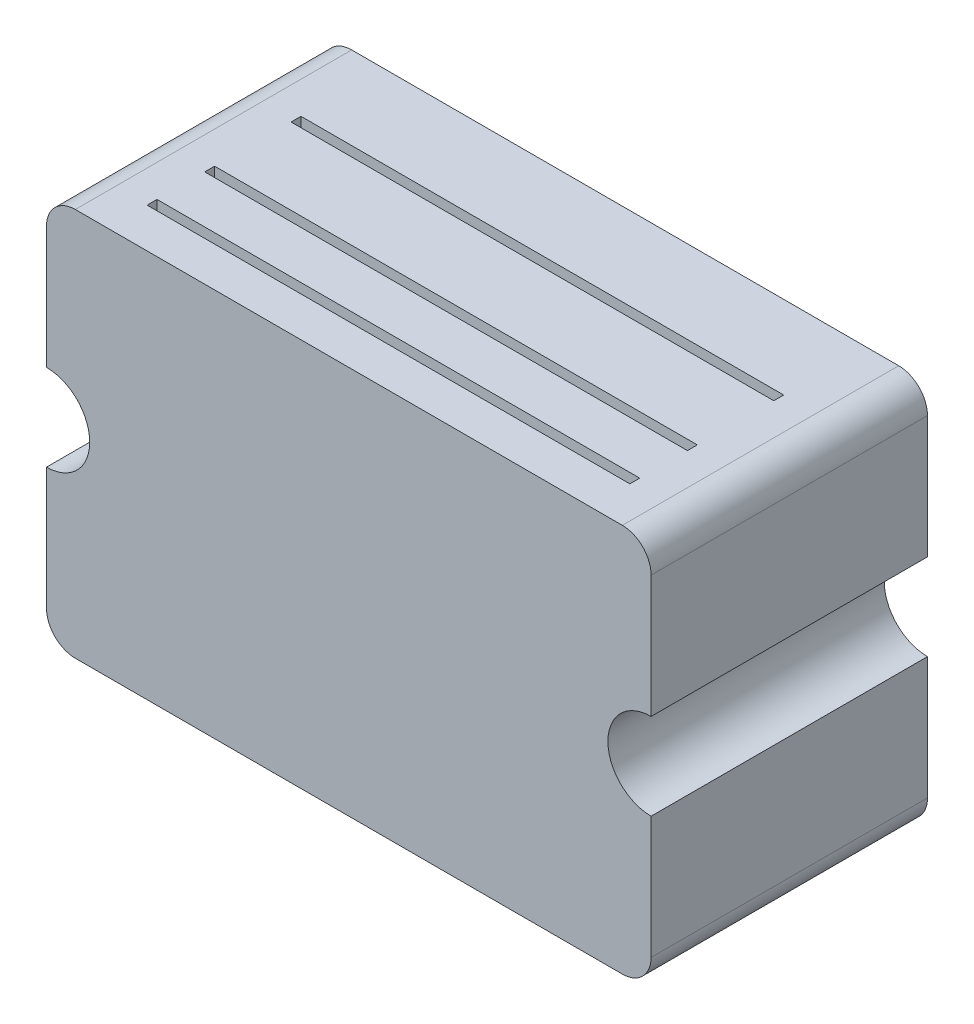
ISO-10303-21;
HEADER;
FILE_DESCRIPTION(('STEP AP214'),'2;1');
FILE_NAME('part.step','',(''),(''),'','','');
FILE_SCHEMA(('AUTOMOTIVE_DESIGN { 1 0 10303 214 1 1 1 1 }'));
ENDSEC;
DATA;
#1=APPLICATION_CONTEXT('core data for automotive mechanical design processes');
#2=APPLICATION_PROTOCOL_DEFINITION('international standard','automotive_design',2000,#1);
#3=PRODUCT_CONTEXT('',#1,'mechanical');
#4=PRODUCT('Part','Part','',(#3));
#5=PRODUCT_RELATED_PRODUCT_CATEGORY('part','',(#4));
#6=PRODUCT_DEFINITION_FORMATION('','',#4);
#7=PRODUCT_DEFINITION_CONTEXT('part definition',#1,'design');
#8=PRODUCT_DEFINITION('design','',#6,#7);
#9=PRODUCT_DEFINITION_SHAPE('','',#8);
#10=(LENGTH_UNIT() NAMED_UNIT(*) SI_UNIT(.MILLI.,.METRE.));
#11=(NAMED_UNIT(*) PLANE_ANGLE_UNIT() SI_UNIT($,.RADIAN.));
#12=(NAMED_UNIT(*) SI_UNIT($,.STERADIAN.) SOLID_ANGLE_UNIT());
#13=UNCERTAINTY_MEASURE_WITH_UNIT(LENGTH_MEASURE(1.E-05),#10,'distance_accuracy_value','');
#14=(GEOMETRIC_REPRESENTATION_CONTEXT(3) GLOBAL_UNCERTAINTY_ASSIGNED_CONTEXT((#13)) GLOBAL_UNIT_ASSIGNED_CONTEXT((#10,
#11,#12)) REPRESENTATION_CONTEXT('',''));
#15=CARTESIAN_POINT('',(0.,0.,0.));
#16=DIRECTION('',(0.,0.,1.));
#17=DIRECTION('',(1.,0.,0.));
#18=AXIS2_PLACEMENT_3D('',#15,#16,#17);
#19=CARTESIAN_POINT('',(-0.838391795984,0.675,0.307810488195));
#20=DIRECTION('',(-1.,0.,0.));
#21=DIRECTION('',(0.,0.,1.));
#22=AXIS2_PLACEMENT_3D('',#19,#20,#21);
#23=PLANE('',#22);
#24=DIRECTION('',(0.,1.,0.));
#25=VECTOR('',#24,1.);
#26=CARTESIAN_POINT('',(-0.838391795984,0.675,0.342189511805));
#27=LINE('',#26,#25);
#28=CARTESIAN_POINT('',(-0.838391795984,0.675,0.342189511805));
#29=VERTEX_POINT('',#28);
#30=CARTESIAN_POINT('',(-0.838391795984,-0.675,0.342189511805));
#31=VERTEX_POINT('',#30);
#32=EDGE_CURVE('E303',#29,#31,#27,.F.);
#33=ORIENTED_EDGE('',*,*,#32,.T.);
#34=DIRECTION('',(0.,0.,1.));
#35=VECTOR('',#34,1.);
#36=CARTESIAN_POINT('',(-0.838391795984,-0.675,0.307810488195));
#37=LINE('',#36,#35);
#38=CARTESIAN_POINT('',(-0.838391795984,-0.675,0.307810488195));
#39=VERTEX_POINT('',#38);
#40=EDGE_CURVE('E181',#39,#31,#37,.T.);
#41=ORIENTED_EDGE('',*,*,#40,.F.);
#42=DIRECTION('',(0.,1.,0.));
#43=VECTOR('',#42,1.);
#44=CARTESIAN_POINT('',(-0.838391795984,0.675,0.307810488195));
#45=LINE('',#44,#43);
#46=CARTESIAN_POINT('',(-0.838391795984,0.675,0.307810488195));
#47=VERTEX_POINT('',#46);
#48=EDGE_CURVE('E306',#39,#47,#45,.T.);
#49=ORIENTED_EDGE('',*,*,#48,.T.);
#50=DIRECTION('',(0.,0.,1.));
#51=VECTOR('',#50,1.);
#52=CARTESIAN_POINT('',(-0.838391795984,0.675,0.307810488195));
#53=LINE('',#52,#51);
#54=EDGE_CURVE('E178',#29,#47,#53,.F.);
#55=ORIENTED_EDGE('',*,*,#54,.F.);
#56=EDGE_LOOP('',(#33,#41,#49,#55));
#57=FACE_BOUND('',#56,.T.);
#58=ADVANCED_FACE('F17',(#57),#23,.F.);
#59=CARTESIAN_POINT('',(0.838391795984,0.675,0.342189511805));
#60=DIRECTION('',(1.,0.,0.));
#61=DIRECTION('',(0.,0.,-1.));
#62=AXIS2_PLACEMENT_3D('',#59,#60,#61);
#63=PLANE('',#62);
#64=DIRECTION('',(0.,1.,0.));
#65=VECTOR('',#64,1.);
#66=CARTESIAN_POINT('',(0.838391795984,0.675,0.307810488195));
#67=LINE('',#66,#65);
#68=CARTESIAN_POINT('',(0.838391795984,0.675,0.307810488195));
#69=VERTEX_POINT('',#68);
#70=CARTESIAN_POINT('',(0.838391795984,-0.675,0.307810488195));
#71=VERTEX_POINT('',#70);
#72=EDGE_CURVE('E212',#69,#71,#67,.F.);
#73=ORIENTED_EDGE('',*,*,#72,.T.);
#74=DIRECTION('',(0.,0.,-1.));
#75=VECTOR('',#74,1.);
#76=CARTESIAN_POINT('',(0.838391795984,-0.675,0.342189511805));
#77=LINE('',#76,#75);
#78=CARTESIAN_POINT('',(0.838391795984,-0.675,0.342189511805));
#79=VERTEX_POINT('',#78);
#80=EDGE_CURVE('E175',#79,#71,#77,.T.);
#81=ORIENTED_EDGE('',*,*,#80,.F.);
#82=DIRECTION('',(0.,1.,0.));
#83=VECTOR('',#82,1.);
#84=CARTESIAN_POINT('',(0.838391795984,0.675,0.342189511805));
#85=LINE('',#84,#83);
#86=CARTESIAN_POINT('',(0.838391795984,0.675,0.342189511805));
#87=VERTEX_POINT('',#86);
#88=EDGE_CURVE('E300',#79,#87,#85,.T.);
#89=ORIENTED_EDGE('',*,*,#88,.T.);
#90=DIRECTION('',(0.,0.,-1.));
#91=VECTOR('',#90,1.);
#92=CARTESIAN_POINT('',(0.838391795984,0.675,0.342189511805));
#93=LINE('',#92,#91);
#94=EDGE_CURVE('E172',#69,#87,#93,.F.);
#95=ORIENTED_EDGE('',*,*,#94,.F.);
#96=EDGE_LOOP('',(#73,#81,#89,#95));
#97=FACE_BOUND('',#96,.T.);
#98=ADVANCED_FACE('F315',(#97),#63,.F.);
#99=CARTESIAN_POINT('',(-0.838391795984,0.675,0.607810488195));
#100=DIRECTION('',(-1.,0.,0.));
#101=DIRECTION('',(0.,0.,1.));
#102=AXIS2_PLACEMENT_3D('',#99,#100,#101);
#103=PLANE('',#102);
#104=DIRECTION('',(0.,1.,0.));
#105=VECTOR('',#104,1.);
#106=CARTESIAN_POINT('',(-0.838391795984,0.675,0.642189511805));
#107=LINE('',#106,#105);
#108=CARTESIAN_POINT('',(-0.838391795984,0.675,0.642189511805));
#109=VERTEX_POINT('',#108);
#110=CARTESIAN_POINT('',(-0.838391795984,-0.675,0.642189511805));
#111=VERTEX_POINT('',#110);
#112=EDGE_CURVE('E291',#109,#111,#107,.F.);
#113=ORIENTED_EDGE('',*,*,#112,.T.);
#114=DIRECTION('',(0.,0.,1.));
#115=VECTOR('',#114,1.);
#116=CARTESIAN_POINT('',(-0.838391795984,-0.675,0.607810488195));
#117=LINE('',#116,#115);
#118=CARTESIAN_POINT('',(-0.838391795984,-0.675,0.607810488195));
#119=VERTEX_POINT('',#118);
#120=EDGE_CURVE('E169',#119,#111,#117,.T.);
#121=ORIENTED_EDGE('',*,*,#120,.F.);
#122=DIRECTION('',(0.,1.,0.));
#123=VECTOR('',#122,1.);
#124=CARTESIAN_POINT('',(-0.838391795984,0.675,0.607810488195));
#125=LINE('',#124,#123);
#126=CARTESIAN_POINT('',(-0.838391795984,0.675,0.607810488195));
#127=VERTEX_POINT('',#126);
#128=EDGE_CURVE('E294',#119,#127,#125,.T.);
#129=ORIENTED_EDGE('',*,*,#128,.T.);
#130=DIRECTION('',(0.,0.,1.));
#131=VECTOR('',#130,1.);
#132=CARTESIAN_POINT('',(-0.838391795984,0.675,0.607810488195));
#133=LINE('',#132,#131);
#134=EDGE_CURVE('E166',#109,#127,#133,.F.);
#135=ORIENTED_EDGE('',*,*,#134,.F.);
#136=EDGE_LOOP('',(#113,#121,#129,#135));
#137=FACE_BOUND('',#136,.T.);
#138=ADVANCED_FACE('F402',(#137),#103,.F.);
#139=CARTESIAN_POINT('',(0.838391795984,0.675,0.642189511805));
#140=DIRECTION('',(1.,0.,0.));
#141=DIRECTION('',(0.,0.,-1.));
#142=AXIS2_PLACEMENT_3D('',#139,#140,#141);
#143=PLANE('',#142);
#144=DIRECTION('',(0.,1.,0.));
#145=VECTOR('',#144,1.);
#146=CARTESIAN_POINT('',(0.838391795984,0.675,0.607810488195));
#147=LINE('',#146,#145);
#148=CARTESIAN_POINT('',(0.838391795984,0.675,0.607810488195));
#149=VERTEX_POINT('',#148);
#150=CARTESIAN_POINT('',(0.838391795984,-0.675,0.607810488195));
#151=VERTEX_POINT('',#150);
#152=EDGE_CURVE('E297',#149,#151,#147,.F.);
#153=ORIENTED_EDGE('',*,*,#152,.T.);
#154=DIRECTION('',(0.,0.,-1.));
#155=VECTOR('',#154,1.);
#156=CARTESIAN_POINT('',(0.838391795984,-0.675,0.642189511805));
#157=LINE('',#156,#155);
#158=CARTESIAN_POINT('',(0.838391795984,-0.675,0.642189511805));
#159=VERTEX_POINT('',#158);
#160=EDGE_CURVE('E163',#159,#151,#157,.T.);
#161=ORIENTED_EDGE('',*,*,#160,.F.);
#162=DIRECTION('',(0.,1.,0.));
#163=VECTOR('',#162,1.);
#164=CARTESIAN_POINT('',(0.838391795984,0.675,0.642189511805));
#165=LINE('',#164,#163);
#166=CARTESIAN_POINT('',(0.838391795984,0.675,0.642189511805));
#167=VERTEX_POINT('',#166);
#168=EDGE_CURVE('E288',#159,#167,#165,.T.);
#169=ORIENTED_EDGE('',*,*,#168,.T.);
#170=DIRECTION('',(0.,0.,-1.));
#171=VECTOR('',#170,1.);
#172=CARTESIAN_POINT('',(0.838391795984,0.675,0.642189511805));
#173=LINE('',#172,#171);
#174=EDGE_CURVE('E160',#149,#167,#173,.F.);
#175=ORIENTED_EDGE('',*,*,#174,.F.);
#176=EDGE_LOOP('',(#153,#161,#169,#175));
#177=FACE_BOUND('',#176,.T.);
#178=ADVANCED_FACE('F396',(#177),#143,.F.);
#179=CARTESIAN_POINT('',(-0.838391795984,0.675,0.807810488195));
#180=DIRECTION('',(-1.,0.,0.));
#181=DIRECTION('',(0.,0.,1.));
#182=AXIS2_PLACEMENT_3D('',#179,#180,#181);
#183=PLANE('',#182);
#184=DIRECTION('',(0.,1.,0.));
#185=VECTOR('',#184,1.);
#186=CARTESIAN_POINT('',(-0.838391795984,0.675,0.842189511805));
#187=LINE('',#186,#185);
#188=CARTESIAN_POINT('',(-0.838391795984,0.675,0.842189511805));
#189=VERTEX_POINT('',#188);
#190=CARTESIAN_POINT('',(-0.838391795984,-0.675,0.842189511805));
#191=VERTEX_POINT('',#190);
#192=EDGE_CURVE('E279',#189,#191,#187,.F.);
#193=ORIENTED_EDGE('',*,*,#192,.T.);
#194=DIRECTION('',(0.,0.,1.));
#195=VECTOR('',#194,1.);
#196=CARTESIAN_POINT('',(-0.838391795984,-0.675,0.807810488195));
#197=LINE('',#196,#195);
#198=CARTESIAN_POINT('',(-0.838391795984,-0.675,0.807810488195));
#199=VERTEX_POINT('',#198);
#200=EDGE_CURVE('E157',#199,#191,#197,.T.);
#201=ORIENTED_EDGE('',*,*,#200,.F.);
#202=DIRECTION('',(0.,1.,0.));
#203=VECTOR('',#202,1.);
#204=CARTESIAN_POINT('',(-0.838391795984,0.675,0.807810488195));
#205=LINE('',#204,#203);
#206=CARTESIAN_POINT('',(-0.838391795984,0.675,0.807810488195));
#207=VERTEX_POINT('',#206);
#208=EDGE_CURVE('E282',#199,#207,#205,.T.);
#209=ORIENTED_EDGE('',*,*,#208,.T.);
#210=DIRECTION('',(0.,0.,1.));
#211=VECTOR('',#210,1.);
#212=CARTESIAN_POINT('',(-0.838391795984,0.675,0.807810488195));
#213=LINE('',#212,#211);
#214=EDGE_CURVE('E154',#189,#207,#213,.F.);
#215=ORIENTED_EDGE('',*,*,#214,.F.);
#216=EDGE_LOOP('',(#193,#201,#209,#215));
#217=FACE_BOUND('',#216,.T.);
#218=ADVANCED_FACE('F373',(#217),#183,.F.);
#219=CARTESIAN_POINT('',(0.838391795984,0.675,0.842189511805));
#220=DIRECTION('',(1.,0.,0.));
#221=DIRECTION('',(0.,0.,-1.));
#222=AXIS2_PLACEMENT_3D('',#219,#220,#221);
#223=PLANE('',#222);
#224=DIRECTION('',(0.,1.,0.));
#225=VECTOR('',#224,1.);
#226=CARTESIAN_POINT('',(0.838391795984,0.675,0.807810488195));
#227=LINE('',#226,#225);
#228=CARTESIAN_POINT('',(0.838391795984,0.675,0.807810488195));
#229=VERTEX_POINT('',#228);
#230=CARTESIAN_POINT('',(0.838391795984,-0.675,0.807810488195));
#231=VERTEX_POINT('',#230);
#232=EDGE_CURVE('E285',#229,#231,#227,.F.);
#233=ORIENTED_EDGE('',*,*,#232,.T.);
#234=DIRECTION('',(0.,0.,-1.));
#235=VECTOR('',#234,1.);
#236=CARTESIAN_POINT('',(0.838391795984,-0.675,0.842189511805));
#237=LINE('',#236,#235);
#238=CARTESIAN_POINT('',(0.838391795984,-0.675,0.842189511805));
#239=VERTEX_POINT('',#238);
#240=EDGE_CURVE('E139',#239,#231,#237,.T.);
#241=ORIENTED_EDGE('',*,*,#240,.F.);
#242=DIRECTION('',(0.,1.,0.));
#243=VECTOR('',#242,1.);
#244=CARTESIAN_POINT('',(0.838391795984,0.675,0.842189511805));
#245=LINE('',#244,#243);
#246=CARTESIAN_POINT('',(0.838391795984,0.675,0.842189511805));
#247=VERTEX_POINT('',#246);
#248=EDGE_CURVE('E275',#239,#247,#245,.T.);
#249=ORIENTED_EDGE('',*,*,#248,.T.);
#250=DIRECTION('',(0.,0.,-1.));
#251=VECTOR('',#250,1.);
#252=CARTESIAN_POINT('',(0.838391795984,0.675,0.842189511805));
#253=LINE('',#252,#251);
#254=EDGE_CURVE('E135',#229,#247,#253,.F.);
#255=ORIENTED_EDGE('',*,*,#254,.F.);
#256=EDGE_LOOP('',(#233,#241,#249,#255));
#257=FACE_BOUND('',#256,.T.);
#258=ADVANCED_FACE('F365',(#257),#223,.F.);
#259=CARTESIAN_POINT('',(0.,0.,0.02));
#260=DIRECTION('',(0.,0.,1.));
#261=DIRECTION('',(1.,0.,0.));
#262=AXIS2_PLACEMENT_3D('',#259,#260,#261);
#263=PLANE('',#262);
#264=DIRECTION('',(1.,0.,0.));
#265=VECTOR('',#264,1.);
#266=CARTESIAN_POINT('',(1.05,0.675,0.02));
#267=LINE('',#266,#265);
#268=CARTESIAN_POINT('',(0.95,0.675,0.02));
#269=VERTEX_POINT('',#268);
#270=CARTESIAN_POINT('',(-0.95,0.675,0.02));
#271=VERTEX_POINT('',#270);
#272=EDGE_CURVE('E273',#269,#271,#267,.F.);
#273=ORIENTED_EDGE('',*,*,#272,.F.);
#274=CARTESIAN_POINT('',(0.95,0.575,0.02));
#275=DIRECTION('',(0.,0.,1.));
#276=DIRECTION('',(1.,0.,0.));
#277=AXIS2_PLACEMENT_3D('',#274,#275,#276);
#278=CIRCLE('',#277,0.1);
#279=CARTESIAN_POINT('',(1.05,0.575,0.02));
#280=VERTEX_POINT('',#279);
#281=EDGE_CURVE('E207',#280,#269,#278,.T.);
#282=ORIENTED_EDGE('',*,*,#281,.F.);
#283=DIRECTION('',(0.,1.,0.));
#284=VECTOR('',#283,1.);
#285=CARTESIAN_POINT('',(1.05,-0.675,0.02));
#286=LINE('',#285,#284);
#287=CARTESIAN_POINT('',(1.05,0.15,0.02));
#288=VERTEX_POINT('',#287);
#289=EDGE_CURVE('E147',#288,#280,#286,.T.);
#290=ORIENTED_EDGE('',*,*,#289,.F.);
#291=CARTESIAN_POINT('',(1.05,0.,0.0200000000000001));
#292=DIRECTION('',(0.,0.,1.));
#293=DIRECTION('',(1.,0.,0.));
#294=AXIS2_PLACEMENT_3D('',#291,#292,#293);
#295=CIRCLE('',#294,0.15);
#296=CARTESIAN_POINT('',(1.05,-0.15,0.02));
#297=VERTEX_POINT('',#296);
#298=EDGE_CURVE('E149',#288,#297,#295,.T.);
#299=ORIENTED_EDGE('',*,*,#298,.T.);
#300=DIRECTION('',(0.,1.,0.));
#301=VECTOR('',#300,1.);
#302=CARTESIAN_POINT('',(1.05,-0.675,0.02));
#303=LINE('',#302,#301);
#304=CARTESIAN_POINT('',(1.05,-0.575,0.02));
#305=VERTEX_POINT('',#304);
#306=EDGE_CURVE('E143',#305,#297,#303,.T.);
#307=ORIENTED_EDGE('',*,*,#306,.F.);
#308=CARTESIAN_POINT('',(0.95,-0.575,0.02));
#309=DIRECTION('',(0.,0.,1.));
#310=DIRECTION('',(1.,0.,0.));
#311=AXIS2_PLACEMENT_3D('',#308,#309,#310);
#312=CIRCLE('',#311,0.1);
#313=CARTESIAN_POINT('',(0.95,-0.675,0.02));
#314=VERTEX_POINT('',#313);
#315=EDGE_CURVE('E202',#314,#305,#312,.T.);
#316=ORIENTED_EDGE('',*,*,#315,.F.);
#317=DIRECTION('',(1.,0.,0.));
#318=VECTOR('',#317,1.);
#319=CARTESIAN_POINT('',(-1.05,-0.675,0.02));
#320=LINE('',#319,#318);
#321=CARTESIAN_POINT('',(-0.95,-0.675,0.02));
#322=VERTEX_POINT('',#321);
#323=EDGE_CURVE('E219',#322,#314,#320,.T.);
#324=ORIENTED_EDGE('',*,*,#323,.F.);
#325=CARTESIAN_POINT('',(-0.95,-0.575,0.02));
#326=DIRECTION('',(0.,0.,1.));
#327=DIRECTION('',(1.,0.,0.));
#328=AXIS2_PLACEMENT_3D('',#325,#326,#327);
#329=CIRCLE('',#328,0.1);
#330=CARTESIAN_POINT('',(-1.05,-0.575,0.02));
#331=VERTEX_POINT('',#330);
#332=EDGE_CURVE('E117',#331,#322,#329,.T.);
#333=ORIENTED_EDGE('',*,*,#332,.F.);
#334=DIRECTION('',(0.,1.,0.));
#335=VECTOR('',#334,1.);
#336=CARTESIAN_POINT('',(-1.05,0.,0.02));
#337=LINE('',#336,#335);
#338=CARTESIAN_POINT('',(-1.05,-0.15,0.02));
#339=VERTEX_POINT('',#338);
#340=EDGE_CURVE('E112',#339,#331,#337,.F.);
#341=ORIENTED_EDGE('',*,*,#340,.F.);
#342=CARTESIAN_POINT('',(-1.05,0.,0.0200000000000001));
#343=DIRECTION('',(0.,0.,1.));
#344=DIRECTION('',(1.,0.,0.));
#345=AXIS2_PLACEMENT_3D('',#342,#343,#344);
#346=CIRCLE('',#345,0.15);
#347=CARTESIAN_POINT('',(-1.05,0.15,0.02));
#348=VERTEX_POINT('',#347);
#349=EDGE_CURVE('E20',#348,#339,#346,.F.);
#350=ORIENTED_EDGE('',*,*,#349,.F.);
#351=DIRECTION('',(0.,1.,0.));
#352=VECTOR('',#351,1.);
#353=CARTESIAN_POINT('',(-1.05,0.,0.02));
#354=LINE('',#353,#352);
#355=CARTESIAN_POINT('',(-1.05,0.575,0.02));
#356=VERTEX_POINT('',#355);
#357=EDGE_CURVE('E134',#356,#348,#354,.F.);
#358=ORIENTED_EDGE('',*,*,#357,.F.);
#359=CARTESIAN_POINT('',(-0.95,0.575,0.02));
#360=DIRECTION('',(0.,0.,1.));
#361=DIRECTION('',(1.,0.,0.));
#362=AXIS2_PLACEMENT_3D('',#359,#360,#361);
#363=CIRCLE('',#362,0.1);
#364=EDGE_CURVE('E211',#271,#356,#363,.T.);
#365=ORIENTED_EDGE('',*,*,#364,.F.);
#366=EDGE_LOOP('',(#273,#282,#290,#299,#307,#316,#324,#333,#341,#350,#358,#365));
#367=FACE_BOUND('',#366,.T.);
#368=ADVANCED_FACE('F115',(#367),#263,.F.);
#369=CARTESIAN_POINT('',(0.838391795984,0.675,0.307810488195));
#370=DIRECTION('',(0.,0.,-1.));
#371=DIRECTION('',(-1.,0.,0.));
#372=AXIS2_PLACEMENT_3D('',#369,#370,#371);
#373=PLANE('',#372);
#374=ORIENTED_EDGE('',*,*,#48,.F.);
#375=DIRECTION('',(1.,0.,0.));
#376=VECTOR('',#375,1.);
#377=CARTESIAN_POINT('',(-1.05,-0.675,0.307810488195));
#378=LINE('',#377,#376);
#379=EDGE_CURVE('E246',#71,#39,#378,.F.);
#380=ORIENTED_EDGE('',*,*,#379,.F.);
#381=ORIENTED_EDGE('',*,*,#72,.F.);
#382=DIRECTION('',(1.,0.,0.));
#383=VECTOR('',#382,1.);
#384=CARTESIAN_POINT('',(1.05,0.675,0.307810488195));
#385=LINE('',#384,#383);
#386=EDGE_CURVE('E210',#47,#69,#385,.T.);
#387=ORIENTED_EDGE('',*,*,#386,.F.);
#388=EDGE_LOOP('',(#374,#380,#381,#387));
#389=FACE_BOUND('',#388,.T.);
#390=ADVANCED_FACE('F323',(#389),#373,.F.);
#391=CARTESIAN_POINT('',(-0.838391795984,0.675,0.342189511805));
#392=DIRECTION('',(0.,0.,1.));
#393=DIRECTION('',(1.,0.,0.));
#394=AXIS2_PLACEMENT_3D('',#391,#392,#393);
#395=PLANE('',#394);
#396=ORIENTED_EDGE('',*,*,#88,.F.);
#397=DIRECTION('',(1.,0.,0.));
#398=VECTOR('',#397,1.);
#399=CARTESIAN_POINT('',(-1.05,-0.675,0.342189511805));
#400=LINE('',#399,#398);
#401=EDGE_CURVE('E243',#31,#79,#400,.T.);
#402=ORIENTED_EDGE('',*,*,#401,.F.);
#403=ORIENTED_EDGE('',*,*,#32,.F.);
#404=DIRECTION('',(1.,0.,0.));
#405=VECTOR('',#404,1.);
#406=CARTESIAN_POINT('',(1.05,0.675,0.342189511805));
#407=LINE('',#406,#405);
#408=EDGE_CURVE('E258',#87,#29,#407,.F.);
#409=ORIENTED_EDGE('',*,*,#408,.F.);
#410=EDGE_LOOP('',(#396,#402,#403,#409));
#411=FACE_BOUND('',#410,.T.);
#412=ADVANCED_FACE('F591',(#411),#395,.F.);
#413=CARTESIAN_POINT('',(0.838391795984,0.675,0.607810488195));
#414=DIRECTION('',(0.,0.,-1.));
#415=DIRECTION('',(-1.,0.,0.));
#416=AXIS2_PLACEMENT_3D('',#413,#414,#415);
#417=PLANE('',#416);
#418=ORIENTED_EDGE('',*,*,#128,.F.);
#419=DIRECTION('',(1.,0.,0.));
#420=VECTOR('',#419,1.);
#421=CARTESIAN_POINT('',(-1.05,-0.675,0.607810488195));
#422=LINE('',#421,#420);
#423=EDGE_CURVE('E240',#151,#119,#422,.F.);
#424=ORIENTED_EDGE('',*,*,#423,.F.);
#425=ORIENTED_EDGE('',*,*,#152,.F.);
#426=DIRECTION('',(1.,0.,0.));
#427=VECTOR('',#426,1.);
#428=CARTESIAN_POINT('',(1.05,0.675,0.607810488195));
#429=LINE('',#428,#427);
#430=EDGE_CURVE('E261',#127,#149,#429,.T.);
#431=ORIENTED_EDGE('',*,*,#430,.F.);
#432=EDGE_LOOP('',(#418,#424,#425,#431));
#433=FACE_BOUND('',#432,.T.);
#434=ADVANCED_FACE('F400',(#433),#417,.F.);
#435=CARTESIAN_POINT('',(-0.838391795984,0.675,0.642189511805));
#436=DIRECTION('',(0.,0.,1.));
#437=DIRECTION('',(1.,0.,0.));
#438=AXIS2_PLACEMENT_3D('',#435,#436,#437);
#439=PLANE('',#438);
#440=ORIENTED_EDGE('',*,*,#168,.F.);
#441=DIRECTION('',(1.,0.,0.));
#442=VECTOR('',#441,1.);
#443=CARTESIAN_POINT('',(-1.05,-0.675,0.642189511805));
#444=LINE('',#443,#442);
#445=EDGE_CURVE('E237',#111,#159,#444,.T.);
#446=ORIENTED_EDGE('',*,*,#445,.F.);
#447=ORIENTED_EDGE('',*,*,#112,.F.);
#448=DIRECTION('',(1.,0.,0.));
#449=VECTOR('',#448,1.);
#450=CARTESIAN_POINT('',(1.05,0.675,0.642189511805));
#451=LINE('',#450,#449);
#452=EDGE_CURVE('E264',#167,#109,#451,.F.);
#453=ORIENTED_EDGE('',*,*,#452,.F.);
#454=EDGE_LOOP('',(#440,#446,#447,#453));
#455=FACE_BOUND('',#454,.T.);
#456=ADVANCED_FACE('F406',(#455),#439,.F.);
#457=CARTESIAN_POINT('',(0.838391795984,0.675,0.807810488195));
#458=DIRECTION('',(0.,0.,-1.));
#459=DIRECTION('',(-1.,0.,0.));
#460=AXIS2_PLACEMENT_3D('',#457,#458,#459);
#461=PLANE('',#460);
#462=ORIENTED_EDGE('',*,*,#208,.F.);
#463=DIRECTION('',(1.,0.,0.));
#464=VECTOR('',#463,1.);
#465=CARTESIAN_POINT('',(-1.05,-0.675,0.807810488195));
#466=LINE('',#465,#464);
#467=EDGE_CURVE('E232',#231,#199,#466,.F.);
#468=ORIENTED_EDGE('',*,*,#467,.F.);
#469=ORIENTED_EDGE('',*,*,#232,.F.);
#470=DIRECTION('',(1.,0.,0.));
#471=VECTOR('',#470,1.);
#472=CARTESIAN_POINT('',(1.05,0.675,0.807810488195));
#473=LINE('',#472,#471);
#474=EDGE_CURVE('E267',#207,#229,#473,.T.);
#475=ORIENTED_EDGE('',*,*,#474,.F.);
#476=EDGE_LOOP('',(#462,#468,#469,#475));
#477=FACE_BOUND('',#476,.T.);
#478=ADVANCED_FACE('F420',(#477),#461,.F.);
#479=CARTESIAN_POINT('',(-0.838391795984,0.675,0.842189511805));
#480=DIRECTION('',(0.,0.,1.));
#481=DIRECTION('',(1.,0.,0.));
#482=AXIS2_PLACEMENT_3D('',#479,#480,#481);
#483=PLANE('',#482);
#484=ORIENTED_EDGE('',*,*,#248,.F.);
#485=DIRECTION('',(1.,0.,0.));
#486=VECTOR('',#485,1.);
#487=CARTESIAN_POINT('',(-1.05,-0.675,0.842189511805));
#488=LINE('',#487,#486);
#489=EDGE_CURVE('E228',#191,#239,#488,.T.);
#490=ORIENTED_EDGE('',*,*,#489,.F.);
#491=ORIENTED_EDGE('',*,*,#192,.F.);
#492=DIRECTION('',(1.,0.,0.));
#493=VECTOR('',#492,1.);
#494=CARTESIAN_POINT('',(1.05,0.675,0.842189511805));
#495=LINE('',#494,#493);
#496=EDGE_CURVE('E270',#247,#189,#495,.F.);
#497=ORIENTED_EDGE('',*,*,#496,.F.);
#498=EDGE_LOOP('',(#484,#490,#491,#497));
#499=FACE_BOUND('',#498,.T.);
#500=ADVANCED_FACE('F370',(#499),#483,.F.);
#501=CARTESIAN_POINT('',(1.05,0.675,0.));
#502=DIRECTION('',(0.,1.,0.));
#503=DIRECTION('',(0.,0.,1.));
#504=AXIS2_PLACEMENT_3D('',#501,#502,#503);
#505=PLANE('',#504);
#506=ORIENTED_EDGE('',*,*,#54,.T.);
#507=ORIENTED_EDGE('',*,*,#386,.T.);
#508=ORIENTED_EDGE('',*,*,#94,.T.);
#509=ORIENTED_EDGE('',*,*,#408,.T.);
#510=EDGE_LOOP('',(#506,#507,#508,#509));
#511=FACE_BOUND('',#510,.T.);
#512=ORIENTED_EDGE('',*,*,#134,.T.);
#513=ORIENTED_EDGE('',*,*,#430,.T.);
#514=ORIENTED_EDGE('',*,*,#174,.T.);
#515=ORIENTED_EDGE('',*,*,#452,.T.);
#516=EDGE_LOOP('',(#512,#513,#514,#515));
#517=FACE_BOUND('',#516,.T.);
#518=ORIENTED_EDGE('',*,*,#214,.T.);
#519=ORIENTED_EDGE('',*,*,#474,.T.);
#520=ORIENTED_EDGE('',*,*,#254,.T.);
#521=ORIENTED_EDGE('',*,*,#496,.T.);
#522=EDGE_LOOP('',(#518,#519,#520,#521));
#523=FACE_BOUND('',#522,.T.);
#524=DIRECTION('',(0.,0.,1.));
#525=VECTOR('',#524,1.);
#526=CARTESIAN_POINT('',(0.95,0.675,0.));
#527=LINE('',#526,#525);
#528=CARTESIAN_POINT('',(0.95,0.675,0.98));
#529=VERTEX_POINT('',#528);
#530=EDGE_CURVE('E209',#269,#529,#527,.T.);
#531=ORIENTED_EDGE('',*,*,#530,.F.);
#532=ORIENTED_EDGE('',*,*,#272,.T.);
#533=DIRECTION('',(0.,0.,1.));
#534=VECTOR('',#533,1.);
#535=CARTESIAN_POINT('',(-0.95,0.675,0.));
#536=LINE('',#535,#534);
#537=CARTESIAN_POINT('',(-0.95,0.675,0.98));
#538=VERTEX_POINT('',#537);
#539=EDGE_CURVE('E479',#538,#271,#536,.F.);
#540=ORIENTED_EDGE('',*,*,#539,.F.);
#541=DIRECTION('',(-1.,0.,0.));
#542=VECTOR('',#541,1.);
#543=CARTESIAN_POINT('',(0.,0.675,0.98));
#544=LINE('',#543,#542);
#545=EDGE_CURVE('E201',#538,#529,#544,.F.);
#546=ORIENTED_EDGE('',*,*,#545,.T.);
#547=EDGE_LOOP('',(#531,#532,#540,#546));
#548=FACE_BOUND('',#547,.T.);
#549=ADVANCED_FACE('F359',(#511,#517,#523,#548),#505,.T.);
#550=CARTESIAN_POINT('',(0.95,0.575,0.));
#551=DIRECTION('',(0.,0.,1.));
#552=DIRECTION('',(1.,0.,0.));
#553=AXIS2_PLACEMENT_3D('',#550,#551,#552);
#554=CYLINDRICAL_SURFACE('',#553,0.1);
#555=ORIENTED_EDGE('',*,*,#281,.T.);
#556=ORIENTED_EDGE('',*,*,#530,.T.);
#557=CARTESIAN_POINT('',(0.95,0.575,0.98));
#558=DIRECTION('',(0.,0.,1.));
#559=DIRECTION('',(1.,0.,0.));
#560=AXIS2_PLACEMENT_3D('',#557,#558,#559);
#561=CIRCLE('',#560,0.1);
#562=CARTESIAN_POINT('',(1.05,0.575,0.98));
#563=VERTEX_POINT('',#562);
#564=EDGE_CURVE('E198',#529,#563,#561,.F.);
#565=ORIENTED_EDGE('',*,*,#564,.T.);
#566=DIRECTION('',(0.,0.,-1.));
#567=VECTOR('',#566,1.);
#568=CARTESIAN_POINT('',(1.05,0.575,0.));
#569=LINE('',#568,#567);
#570=EDGE_CURVE('E150',#280,#563,#569,.F.);
#571=ORIENTED_EDGE('',*,*,#570,.F.);
#572=EDGE_LOOP('',(#555,#556,#565,#571));
#573=FACE_BOUND('',#572,.T.);
#574=ADVANCED_FACE('F409',(#573),#554,.T.);
#575=CARTESIAN_POINT('',(1.05,-0.675,0.));
#576=DIRECTION('',(1.,0.,0.));
#577=DIRECTION('',(0.,0.,-1.));
#578=AXIS2_PLACEMENT_3D('',#575,#576,#577);
#579=PLANE('',#578);
#580=DIRECTION('',(0.,0.,1.));
#581=VECTOR('',#580,1.);
#582=CARTESIAN_POINT('',(1.05,0.15,1.23));
#583=LINE('',#582,#581);
#584=CARTESIAN_POINT('',(1.05,0.15,0.98));
#585=VERTEX_POINT('',#584);
#586=EDGE_CURVE('E146',#585,#288,#583,.F.);
#587=ORIENTED_EDGE('',*,*,#586,.T.);
#588=ORIENTED_EDGE('',*,*,#289,.T.);
#589=ORIENTED_EDGE('',*,*,#570,.T.);
#590=DIRECTION('',(0.,1.,0.));
#591=VECTOR('',#590,1.);
#592=CARTESIAN_POINT('',(1.05,0.,0.98));
#593=LINE('',#592,#591);
#594=EDGE_CURVE('E197',#563,#585,#593,.F.);
#595=ORIENTED_EDGE('',*,*,#594,.T.);
#596=EDGE_LOOP('',(#587,#588,#589,#595));
#597=FACE_BOUND('',#596,.T.);
#598=ADVANCED_FACE('F417',(#597),#579,.T.);
#599=CARTESIAN_POINT('',(1.05,0.,1.23));
#600=DIRECTION('',(0.,0.,1.));
#601=DIRECTION('',(1.,0.,0.));
#602=AXIS2_PLACEMENT_3D('',#599,#600,#601);
#603=CYLINDRICAL_SURFACE('',#602,0.15);
#604=CARTESIAN_POINT('',(1.05,0.,0.98));
#605=DIRECTION('',(0.,0.,1.));
#606=DIRECTION('',(1.,0.,0.));
#607=AXIS2_PLACEMENT_3D('',#604,#605,#606);
#608=CIRCLE('',#607,0.15);
#609=CARTESIAN_POINT('',(1.05,-0.15,0.98));
#610=VERTEX_POINT('',#609);
#611=EDGE_CURVE('E194',#585,#610,#608,.T.);
#612=ORIENTED_EDGE('',*,*,#611,.T.);
#613=DIRECTION('',(0.,0.,-1.));
#614=VECTOR('',#613,1.);
#615=CARTESIAN_POINT('',(1.05,-0.15,0.));
#616=LINE('',#615,#614);
#617=EDGE_CURVE('E145',#297,#610,#616,.F.);
#618=ORIENTED_EDGE('',*,*,#617,.F.);
#619=ORIENTED_EDGE('',*,*,#298,.F.);
#620=ORIENTED_EDGE('',*,*,#586,.F.);
#621=EDGE_LOOP('',(#612,#618,#619,#620));
#622=FACE_BOUND('',#621,.T.);
#623=ADVANCED_FACE('F451',(#622),#603,.F.);
#624=CARTESIAN_POINT('',(1.05,-0.675,0.));
#625=DIRECTION('',(1.,0.,0.));
#626=DIRECTION('',(0.,0.,-1.));
#627=AXIS2_PLACEMENT_3D('',#624,#625,#626);
#628=PLANE('',#627);
#629=ORIENTED_EDGE('',*,*,#617,.T.);
#630=DIRECTION('',(0.,1.,0.));
#631=VECTOR('',#630,1.);
#632=CARTESIAN_POINT('',(1.05,0.,0.98));
#633=LINE('',#632,#631);
#634=CARTESIAN_POINT('',(1.05,-0.575,0.98));
#635=VERTEX_POINT('',#634);
#636=EDGE_CURVE('E193',#610,#635,#633,.F.);
#637=ORIENTED_EDGE('',*,*,#636,.T.);
#638=DIRECTION('',(0.,0.,1.));
#639=VECTOR('',#638,1.);
#640=CARTESIAN_POINT('',(1.05,-0.575,0.));
#641=LINE('',#640,#639);
#642=EDGE_CURVE('E204',#305,#635,#641,.T.);
#643=ORIENTED_EDGE('',*,*,#642,.F.);
#644=ORIENTED_EDGE('',*,*,#306,.T.);
#645=EDGE_LOOP('',(#629,#637,#643,#644));
#646=FACE_BOUND('',#645,.T.);
#647=ADVANCED_FACE('F447',(#646),#628,.T.);
#648=CARTESIAN_POINT('',(0.95,-0.575,0.));
#649=DIRECTION('',(0.,0.,1.));
#650=DIRECTION('',(1.,0.,0.));
#651=AXIS2_PLACEMENT_3D('',#648,#649,#650);
#652=CYLINDRICAL_SURFACE('',#651,0.1);
#653=ORIENTED_EDGE('',*,*,#315,.T.);
#654=ORIENTED_EDGE('',*,*,#642,.T.);
#655=CARTESIAN_POINT('',(0.95,-0.575,0.98));
#656=DIRECTION('',(0.,0.,1.));
#657=DIRECTION('',(1.,0.,0.));
#658=AXIS2_PLACEMENT_3D('',#655,#656,#657);
#659=CIRCLE('',#658,0.1);
#660=CARTESIAN_POINT('',(0.95,-0.675,0.98));
#661=VERTEX_POINT('',#660);
#662=EDGE_CURVE('E190',#635,#661,#659,.F.);
#663=ORIENTED_EDGE('',*,*,#662,.T.);
#664=DIRECTION('',(0.,0.,-1.));
#665=VECTOR('',#664,1.);
#666=CARTESIAN_POINT('',(0.95,-0.675,0.));
#667=LINE('',#666,#665);
#668=EDGE_CURVE('E223',#314,#661,#667,.F.);
#669=ORIENTED_EDGE('',*,*,#668,.F.);
#670=EDGE_LOOP('',(#653,#654,#663,#669));
#671=FACE_BOUND('',#670,.T.);
#672=ADVANCED_FACE('F444',(#671),#652,.T.);
#673=CARTESIAN_POINT('',(-1.05,-0.675,0.));
#674=DIRECTION('',(0.,-1.,0.));
#675=DIRECTION('',(0.,0.,-1.));
#676=AXIS2_PLACEMENT_3D('',#673,#674,#675);
#677=PLANE('',#676);
#678=ORIENTED_EDGE('',*,*,#200,.T.);
#679=ORIENTED_EDGE('',*,*,#489,.T.);
#680=ORIENTED_EDGE('',*,*,#240,.T.);
#681=ORIENTED_EDGE('',*,*,#467,.T.);
#682=EDGE_LOOP('',(#678,#679,#680,#681));
#683=FACE_BOUND('',#682,.T.);
#684=ORIENTED_EDGE('',*,*,#120,.T.);
#685=ORIENTED_EDGE('',*,*,#445,.T.);
#686=ORIENTED_EDGE('',*,*,#160,.T.);
#687=ORIENTED_EDGE('',*,*,#423,.T.);
#688=EDGE_LOOP('',(#684,#685,#686,#687));
#689=FACE_BOUND('',#688,.T.);
#690=ORIENTED_EDGE('',*,*,#40,.T.);
#691=ORIENTED_EDGE('',*,*,#401,.T.);
#692=ORIENTED_EDGE('',*,*,#80,.T.);
#693=ORIENTED_EDGE('',*,*,#379,.T.);
#694=EDGE_LOOP('',(#690,#691,#692,#693));
#695=FACE_BOUND('',#694,.T.);
#696=ORIENTED_EDGE('',*,*,#668,.T.);
#697=DIRECTION('',(-1.,0.,0.));
#698=VECTOR('',#697,1.);
#699=CARTESIAN_POINT('',(0.,-0.675,0.98));
#700=LINE('',#699,#698);
#701=CARTESIAN_POINT('',(-0.95,-0.675,0.98));
#702=VERTEX_POINT('',#701);
#703=EDGE_CURVE('E189',#661,#702,#700,.T.);
#704=ORIENTED_EDGE('',*,*,#703,.T.);
#705=DIRECTION('',(0.,0.,1.));
#706=VECTOR('',#705,1.);
#707=CARTESIAN_POINT('',(-0.95,-0.675,0.));
#708=LINE('',#707,#706);
#709=EDGE_CURVE('E216',#322,#702,#708,.T.);
#710=ORIENTED_EDGE('',*,*,#709,.F.);
#711=ORIENTED_EDGE('',*,*,#323,.T.);
#712=EDGE_LOOP('',(#696,#704,#710,#711));
#713=FACE_BOUND('',#712,.T.);
#714=ADVANCED_FACE('F226',(#683,#689,#695,#713),#677,.T.);
#715=CARTESIAN_POINT('',(-0.95,-0.575,0.));
#716=DIRECTION('',(0.,0.,1.));
#717=DIRECTION('',(1.,0.,0.));
#718=AXIS2_PLACEMENT_3D('',#715,#716,#717);
#719=CYLINDRICAL_SURFACE('',#718,0.1);
#720=ORIENTED_EDGE('',*,*,#332,.T.);
#721=ORIENTED_EDGE('',*,*,#709,.T.);
#722=CARTESIAN_POINT('',(-0.95,-0.575,0.98));
#723=DIRECTION('',(0.,0.,1.));
#724=DIRECTION('',(1.,0.,0.));
#725=AXIS2_PLACEMENT_3D('',#722,#723,#724);
#726=CIRCLE('',#725,0.1);
#727=CARTESIAN_POINT('',(-1.05,-0.575,0.98));
#728=VERTEX_POINT('',#727);
#729=EDGE_CURVE('E186',#702,#728,#726,.F.);
#730=ORIENTED_EDGE('',*,*,#729,.T.);
#731=DIRECTION('',(0.,0.,1.));
#732=VECTOR('',#731,1.);
#733=CARTESIAN_POINT('',(-1.05,-0.575,0.));
#734=LINE('',#733,#732);
#735=EDGE_CURVE('E130',#331,#728,#734,.T.);
#736=ORIENTED_EDGE('',*,*,#735,.F.);
#737=EDGE_LOOP('',(#720,#721,#730,#736));
#738=FACE_BOUND('',#737,.T.);
#739=ADVANCED_FACE('F214',(#738),#719,.T.);
#740=CARTESIAN_POINT('',(-1.05,0.675,0.));
#741=DIRECTION('',(-1.,0.,0.));
#742=DIRECTION('',(0.,0.,1.));
#743=AXIS2_PLACEMENT_3D('',#740,#741,#742);
#744=PLANE('',#743);
#745=DIRECTION('',(0.,0.,1.));
#746=VECTOR('',#745,1.);
#747=CARTESIAN_POINT('',(-1.05,-0.15,1.23));
#748=LINE('',#747,#746);
#749=CARTESIAN_POINT('',(-1.05,-0.15,0.98));
#750=VERTEX_POINT('',#749);
#751=EDGE_CURVE('E122',#750,#339,#748,.F.);
#752=ORIENTED_EDGE('',*,*,#751,.T.);
#753=ORIENTED_EDGE('',*,*,#340,.T.);
#754=ORIENTED_EDGE('',*,*,#735,.T.);
#755=DIRECTION('',(0.,1.,0.));
#756=VECTOR('',#755,1.);
#757=CARTESIAN_POINT('',(-1.05,0.,0.98));
#758=LINE('',#757,#756);
#759=EDGE_CURVE('E125',#728,#750,#758,.T.);
#760=ORIENTED_EDGE('',*,*,#759,.T.);
#761=EDGE_LOOP('',(#752,#753,#754,#760));
#762=FACE_BOUND('',#761,.T.);
#763=ADVANCED_FACE('F123',(#762),#744,.T.);
#764=CARTESIAN_POINT('',(-1.05,0.,1.23));
#765=DIRECTION('',(0.,0.,1.));
#766=DIRECTION('',(1.,0.,0.));
#767=AXIS2_PLACEMENT_3D('',#764,#765,#766);
#768=CYLINDRICAL_SURFACE('',#767,0.15);
#769=ORIENTED_EDGE('',*,*,#349,.T.);
#770=ORIENTED_EDGE('',*,*,#751,.F.);
#771=CARTESIAN_POINT('',(-1.05,0.,0.98));
#772=DIRECTION('',(0.,0.,1.));
#773=DIRECTION('',(1.,0.,0.));
#774=AXIS2_PLACEMENT_3D('',#771,#772,#773);
#775=CIRCLE('',#774,0.15);
#776=CARTESIAN_POINT('',(-1.05,0.15,0.98));
#777=VERTEX_POINT('',#776);
#778=EDGE_CURVE('E184',#750,#777,#775,.T.);
#779=ORIENTED_EDGE('',*,*,#778,.T.);
#780=DIRECTION('',(0.,0.,1.));
#781=VECTOR('',#780,1.);
#782=CARTESIAN_POINT('',(-1.05,0.15,0.));
#783=LINE('',#782,#781);
#784=EDGE_CURVE('E129',#348,#777,#783,.T.);
#785=ORIENTED_EDGE('',*,*,#784,.F.);
#786=EDGE_LOOP('',(#769,#770,#779,#785));
#787=FACE_BOUND('',#786,.T.);
#788=ADVANCED_FACE('F132',(#787),#768,.F.);
#789=CARTESIAN_POINT('',(-1.05,0.675,0.));
#790=DIRECTION('',(-1.,0.,0.));
#791=DIRECTION('',(0.,0.,1.));
#792=AXIS2_PLACEMENT_3D('',#789,#790,#791);
#793=PLANE('',#792);
#794=ORIENTED_EDGE('',*,*,#784,.T.);
#795=DIRECTION('',(0.,1.,0.));
#796=VECTOR('',#795,1.);
#797=CARTESIAN_POINT('',(-1.05,0.,0.98));
#798=LINE('',#797,#796);
#799=CARTESIAN_POINT('',(-1.05,0.575,0.98));
#800=VERTEX_POINT('',#799);
#801=EDGE_CURVE('E26',#777,#800,#798,.T.);
#802=ORIENTED_EDGE('',*,*,#801,.T.);
#803=DIRECTION('',(0.,0.,1.));
#804=VECTOR('',#803,1.);
#805=CARTESIAN_POINT('',(-1.05,0.575,0.));
#806=LINE('',#805,#804);
#807=EDGE_CURVE('E34',#356,#800,#806,.T.);
#808=ORIENTED_EDGE('',*,*,#807,.F.);
#809=ORIENTED_EDGE('',*,*,#357,.T.);
#810=EDGE_LOOP('',(#794,#802,#808,#809));
#811=FACE_BOUND('',#810,.T.);
#812=ADVANCED_FACE('F430',(#811),#793,.T.);
#813=CARTESIAN_POINT('',(-0.95,0.575,0.));
#814=DIRECTION('',(0.,0.,1.));
#815=DIRECTION('',(1.,0.,0.));
#816=AXIS2_PLACEMENT_3D('',#813,#814,#815);
#817=CYLINDRICAL_SURFACE('',#816,0.1);
#818=ORIENTED_EDGE('',*,*,#364,.T.);
#819=ORIENTED_EDGE('',*,*,#807,.T.);
#820=CARTESIAN_POINT('',(-0.95,0.575,0.98));
#821=DIRECTION('',(0.,0.,1.));
#822=DIRECTION('',(1.,0.,0.));
#823=AXIS2_PLACEMENT_3D('',#820,#821,#822);
#824=CIRCLE('',#823,0.1);
#825=EDGE_CURVE('E11',#800,#538,#824,.F.);
#826=ORIENTED_EDGE('',*,*,#825,.T.);
#827=ORIENTED_EDGE('',*,*,#539,.T.);
#828=EDGE_LOOP('',(#818,#819,#826,#827));
#829=FACE_BOUND('',#828,.T.);
#830=ADVANCED_FACE('F424',(#829),#817,.T.);
#831=CARTESIAN_POINT('',(0.,0.,0.98));
#832=DIRECTION('',(0.,0.,-1.));
#833=DIRECTION('',(-1.,0.,0.));
#834=AXIS2_PLACEMENT_3D('',#831,#832,#833);
#835=PLANE('',#834);
#836=ORIENTED_EDGE('',*,*,#801,.F.);
#837=ORIENTED_EDGE('',*,*,#778,.F.);
#838=ORIENTED_EDGE('',*,*,#759,.F.);
#839=ORIENTED_EDGE('',*,*,#729,.F.);
#840=ORIENTED_EDGE('',*,*,#703,.F.);
#841=ORIENTED_EDGE('',*,*,#662,.F.);
#842=ORIENTED_EDGE('',*,*,#636,.F.);
#843=ORIENTED_EDGE('',*,*,#611,.F.);
#844=ORIENTED_EDGE('',*,*,#594,.F.);
#845=ORIENTED_EDGE('',*,*,#564,.F.);
#846=ORIENTED_EDGE('',*,*,#545,.F.);
#847=ORIENTED_EDGE('',*,*,#825,.F.);
#848=EDGE_LOOP('',(#836,#837,#838,#839,#840,#841,#842,#843,#844,#845,#846,#847));
#849=FACE_BOUND('',#848,.T.);
#850=ADVANCED_FACE('F422',(#849),#835,.F.);
#851=CLOSED_SHELL('',(#58,#98,#138,#178,#218,#258,#368,#390,#412,#434,#456,#478,#500,#549,#574,
#598,#623,#647,#672,#714,#739,#763,#788,#812,#830,#850));
#852=MANIFOLD_SOLID_BREP('B1',#851);
#853=ADVANCED_BREP_SHAPE_REPRESENTATION('',(#18,#852),#14);
#854=SHAPE_DEFINITION_REPRESENTATION(#9,#853);
ENDSEC;
END-ISO-10303-21;
